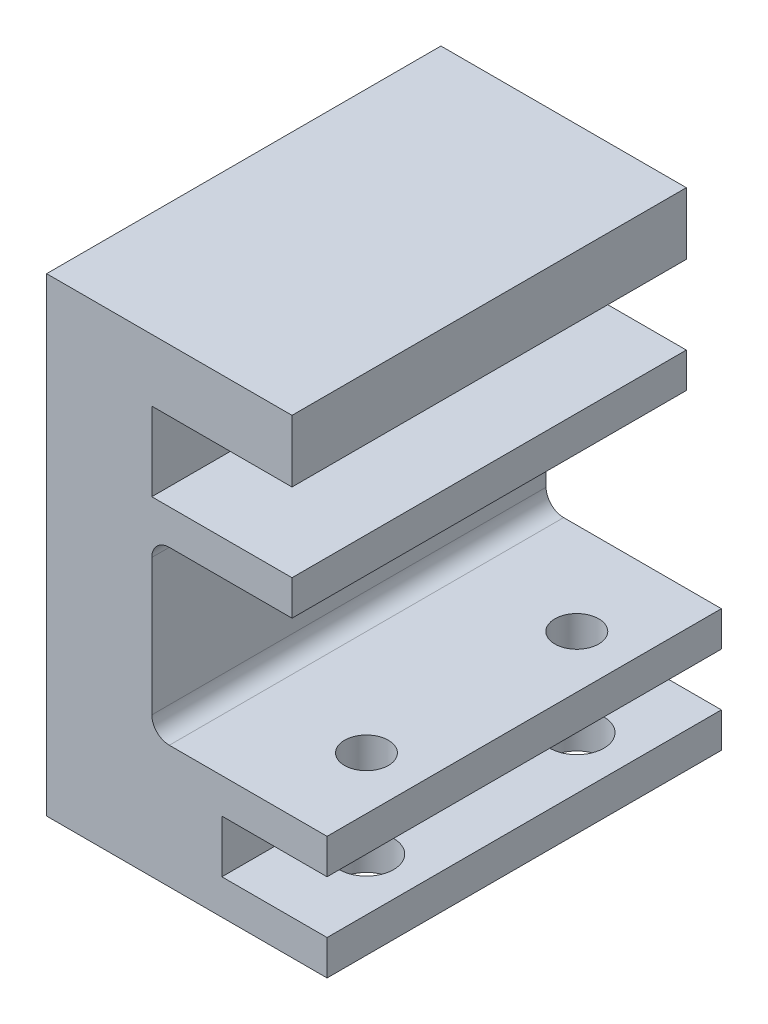
ISO-10303-21;
HEADER;
FILE_DESCRIPTION(('STEP AP214'),'2;1');
FILE_NAME('part.step','',(''),(''),'','','');
FILE_SCHEMA(('AUTOMOTIVE_DESIGN { 1 0 10303 214 1 1 1 1 }'));
ENDSEC;
DATA;
#1=APPLICATION_CONTEXT('core data for automotive mechanical design processes');
#2=APPLICATION_PROTOCOL_DEFINITION('international standard','automotive_design',2000,#1);
#3=PRODUCT_CONTEXT('',#1,'mechanical');
#4=PRODUCT('Part','Part','',(#3));
#5=PRODUCT_RELATED_PRODUCT_CATEGORY('part','',(#4));
#6=PRODUCT_DEFINITION_FORMATION('','',#4);
#7=PRODUCT_DEFINITION_CONTEXT('part definition',#1,'design');
#8=PRODUCT_DEFINITION('design','',#6,#7);
#9=PRODUCT_DEFINITION_SHAPE('','',#8);
#10=(LENGTH_UNIT() NAMED_UNIT(*) SI_UNIT(.MILLI.,.METRE.));
#11=(NAMED_UNIT(*) PLANE_ANGLE_UNIT() SI_UNIT($,.RADIAN.));
#12=(NAMED_UNIT(*) SI_UNIT($,.STERADIAN.) SOLID_ANGLE_UNIT());
#13=UNCERTAINTY_MEASURE_WITH_UNIT(LENGTH_MEASURE(1.E-05),#10,'distance_accuracy_value','');
#14=(GEOMETRIC_REPRESENTATION_CONTEXT(3) GLOBAL_UNCERTAINTY_ASSIGNED_CONTEXT((#13)) GLOBAL_UNIT_ASSIGNED_CONTEXT((#10,
#11,#12)) REPRESENTATION_CONTEXT('',''));
#15=CARTESIAN_POINT('',(0.,0.,0.));
#16=DIRECTION('',(0.,0.,1.));
#17=DIRECTION('',(1.,0.,0.));
#18=AXIS2_PLACEMENT_3D('',#15,#16,#17);
#19=CARTESIAN_POINT('',(-6.34998882399999,-20.32,-35.7134));
#20=DIRECTION('',(0.,-1.,0.));
#21=DIRECTION('',(0.,0.,-1.));
#22=AXIS2_PLACEMENT_3D('',#19,#20,#21);
#23=PLANE('',#22);
#24=CARTESIAN_POINT('',(15.875,-20.32,19.0500000000001));
#25=DIRECTION('',(0.,1.,0.));
#26=DIRECTION('',(0.,0.,1.));
#27=AXIS2_PLACEMENT_3D('',#24,#25,#26);
#28=CIRCLE('',#27,3.96875);
#29=CARTESIAN_POINT('',(15.875,-20.32,23.0187500000001));
#30=VERTEX_POINT('',#29);
#31=EDGE_CURVE('E407',#30,#30,#28,.T.);
#32=ORIENTED_EDGE('',*,*,#31,.F.);
#33=EDGE_LOOP('',(#32));
#34=FACE_BOUND('',#33,.T.);
#35=DIRECTION('',(1.,0.,0.));
#36=VECTOR('',#35,1.);
#37=CARTESIAN_POINT('',(-6.34998882399999,-20.32,-35.7124));
#38=LINE('',#37,#36);
#39=CARTESIAN_POINT('',(-3.17498882399999,-20.32,-35.7124));
#40=VERTEX_POINT('',#39);
#41=CARTESIAN_POINT('',(25.4,-20.32,-35.7124));
#42=VERTEX_POINT('',#41);
#43=EDGE_CURVE('E285',#40,#42,#38,.T.);
#44=ORIENTED_EDGE('',*,*,#43,.F.);
#45=DIRECTION('',(0.,0.,1.));
#46=VECTOR('',#45,1.);
#47=CARTESIAN_POINT('',(-3.17498882399999,-20.32,35.7124));
#48=LINE('',#47,#46);
#49=CARTESIAN_POINT('',(-3.17498882399999,-20.32,35.7124));
#50=VERTEX_POINT('',#49);
#51=EDGE_CURVE('E258',#40,#50,#48,.T.);
#52=ORIENTED_EDGE('',*,*,#51,.T.);
#53=DIRECTION('',(1.,0.,0.));
#54=VECTOR('',#53,1.);
#55=CARTESIAN_POINT('',(-6.34998882399999,-20.32,35.7124));
#56=LINE('',#55,#54);
#57=CARTESIAN_POINT('',(25.4,-20.32,35.7124));
#58=VERTEX_POINT('',#57);
#59=EDGE_CURVE('E208',#50,#58,#56,.T.);
#60=ORIENTED_EDGE('',*,*,#59,.T.);
#61=DIRECTION('',(0.,0.,1.));
#62=VECTOR('',#61,1.);
#63=CARTESIAN_POINT('',(25.4,-20.32,-35.7134));
#64=LINE('',#63,#62);
#65=EDGE_CURVE('E200',#42,#58,#64,.T.);
#66=ORIENTED_EDGE('',*,*,#65,.F.);
#67=EDGE_LOOP('',(#44,#52,#60,#66));
#68=FACE_BOUND('',#67,.T.);
#69=CARTESIAN_POINT('',(15.875,-20.32,-19.0499999999999));
#70=DIRECTION('',(0.,1.,0.));
#71=DIRECTION('',(0.,0.,1.));
#72=AXIS2_PLACEMENT_3D('',#69,#70,#71);
#73=CIRCLE('',#72,3.96875);
#74=CARTESIAN_POINT('',(15.875,-20.32,-15.0812499999999));
#75=VERTEX_POINT('',#74);
#76=EDGE_CURVE('E399',#75,#75,#73,.T.);
#77=ORIENTED_EDGE('',*,*,#76,.F.);
#78=EDGE_LOOP('',(#77));
#79=FACE_BOUND('',#78,.T.);
#80=ADVANCED_FACE('F43',(#34,#68,#79),#23,.F.);
#81=CARTESIAN_POINT('',(-25.4,-42.545,35.7124));
#82=DIRECTION('',(1.,0.,0.));
#83=DIRECTION('',(0.,0.,-1.));
#84=AXIS2_PLACEMENT_3D('',#81,#82,#83);
#85=PLANE('',#84);
#86=DIRECTION('',(0.,-1.,0.));
#87=VECTOR('',#86,1.);
#88=CARTESIAN_POINT('',(-25.4,-42.545,-35.7124));
#89=LINE('',#88,#87);
#90=CARTESIAN_POINT('',(-25.4,42.545,-35.7124));
#91=VERTEX_POINT('',#90);
#92=CARTESIAN_POINT('',(-25.4,-42.545,-35.7124));
#93=VERTEX_POINT('',#92);
#94=EDGE_CURVE('E232',#91,#93,#89,.T.);
#95=ORIENTED_EDGE('',*,*,#94,.T.);
#96=DIRECTION('',(0.,0.,-1.));
#97=VECTOR('',#96,1.);
#98=CARTESIAN_POINT('',(-25.4,-42.545,35.7124));
#99=LINE('',#98,#97);
#100=CARTESIAN_POINT('',(-25.4,-42.545,35.7124));
#101=VERTEX_POINT('',#100);
#102=EDGE_CURVE('E241',#101,#93,#99,.T.);
#103=ORIENTED_EDGE('',*,*,#102,.F.);
#104=DIRECTION('',(0.,-1.,0.));
#105=VECTOR('',#104,1.);
#106=CARTESIAN_POINT('',(-25.4,-42.545,35.7124));
#107=LINE('',#106,#105);
#108=CARTESIAN_POINT('',(-25.4,42.545,35.7124));
#109=VERTEX_POINT('',#108);
#110=EDGE_CURVE('E220',#109,#101,#107,.T.);
#111=ORIENTED_EDGE('',*,*,#110,.F.);
#112=DIRECTION('',(0.,0.,-1.));
#113=VECTOR('',#112,1.);
#114=CARTESIAN_POINT('',(-25.4,42.545,35.7124));
#115=LINE('',#114,#113);
#116=EDGE_CURVE('E245',#109,#91,#115,.T.);
#117=ORIENTED_EDGE('',*,*,#116,.T.);
#118=EDGE_LOOP('',(#95,#103,#111,#117));
#119=FACE_BOUND('',#118,.T.);
#120=CARTESIAN_POINT('',(-25.4,24.13,0.));
#121=DIRECTION('',(-1.,0.,0.));
#122=DIRECTION('',(0.,0.,1.));
#123=AXIS2_PLACEMENT_3D('',#120,#121,#122);
#124=CIRCLE('',#123,2.4892);
#125=CARTESIAN_POINT('',(-25.4,24.13,2.48920000000005));
#126=VERTEX_POINT('',#125);
#127=EDGE_CURVE('E375',#126,#126,#124,.T.);
#128=ORIENTED_EDGE('',*,*,#127,.F.);
#129=EDGE_LOOP('',(#128));
#130=FACE_BOUND('',#129,.T.);
#131=ADVANCED_FACE('F415',(#119,#130),#85,.F.);
#132=CARTESIAN_POINT('',(-25.4,42.545,35.7124));
#133=DIRECTION('',(0.,-1.,0.));
#134=DIRECTION('',(0.,0.,-1.));
#135=AXIS2_PLACEMENT_3D('',#132,#133,#134);
#136=PLANE('',#135);
#137=DIRECTION('',(0.,0.,-1.));
#138=VECTOR('',#137,1.);
#139=CARTESIAN_POINT('',(19.05,42.545,35.712412));
#140=LINE('',#139,#138);
#141=CARTESIAN_POINT('',(19.05,42.545,35.7124));
#142=VERTEX_POINT('',#141);
#143=CARTESIAN_POINT('',(19.05,42.545,-35.7124));
#144=VERTEX_POINT('',#143);
#145=EDGE_CURVE('E179',#142,#144,#140,.T.);
#146=ORIENTED_EDGE('',*,*,#145,.T.);
#147=DIRECTION('',(-1.,0.,0.));
#148=VECTOR('',#147,1.);
#149=CARTESIAN_POINT('',(-25.4,42.545,-35.7124));
#150=LINE('',#149,#148);
#151=EDGE_CURVE('E229',#144,#91,#150,.T.);
#152=ORIENTED_EDGE('',*,*,#151,.T.);
#153=ORIENTED_EDGE('',*,*,#116,.F.);
#154=DIRECTION('',(-1.,0.,0.));
#155=VECTOR('',#154,1.);
#156=CARTESIAN_POINT('',(-25.4,42.545,35.7124));
#157=LINE('',#156,#155);
#158=EDGE_CURVE('E216',#142,#109,#157,.T.);
#159=ORIENTED_EDGE('',*,*,#158,.F.);
#160=EDGE_LOOP('',(#146,#152,#153,#159));
#161=FACE_BOUND('',#160,.T.);
#162=ADVANCED_FACE('F420',(#161),#136,.F.);
#163=CARTESIAN_POINT('',(0.,0.,35.7124));
#164=DIRECTION('',(0.,0.,-1.));
#165=DIRECTION('',(-1.,0.,0.));
#166=AXIS2_PLACEMENT_3D('',#163,#164,#165);
#167=PLANE('',#166);
#168=DIRECTION('',(0.,-1.,0.));
#169=VECTOR('',#168,1.);
#170=CARTESIAN_POINT('',(19.05,0.,35.7124));
#171=LINE('',#170,#169);
#172=CARTESIAN_POINT('',(19.05,31.29915,35.7124));
#173=VERTEX_POINT('',#172);
#174=EDGE_CURVE('E358',#142,#173,#171,.T.);
#175=ORIENTED_EDGE('',*,*,#174,.F.);
#176=ORIENTED_EDGE('',*,*,#158,.T.);
#177=ORIENTED_EDGE('',*,*,#110,.T.);
#178=DIRECTION('',(1.,0.,0.));
#179=VECTOR('',#178,1.);
#180=CARTESIAN_POINT('',(-25.4,-42.545,35.7124));
#181=LINE('',#180,#179);
#182=CARTESIAN_POINT('',(25.4,-42.545,35.7124));
#183=VERTEX_POINT('',#182);
#184=EDGE_CURVE('E223',#101,#183,#181,.T.);
#185=ORIENTED_EDGE('',*,*,#184,.T.);
#186=DIRECTION('',(0.,1.,0.));
#187=VECTOR('',#186,1.);
#188=CARTESIAN_POINT('',(25.4,-42.545,35.7124));
#189=LINE('',#188,#187);
#190=CARTESIAN_POINT('',(25.4,-36.195,35.7124));
#191=VERTEX_POINT('',#190);
#192=EDGE_CURVE('E212',#183,#191,#189,.T.);
#193=ORIENTED_EDGE('',*,*,#192,.T.);
#194=DIRECTION('',(1.,0.,0.));
#195=VECTOR('',#194,1.);
#196=CARTESIAN_POINT('',(6.35000000000001,-36.195,35.7124));
#197=LINE('',#196,#195);
#198=CARTESIAN_POINT('',(6.35000000000001,-36.195,35.7124));
#199=VERTEX_POINT('',#198);
#200=EDGE_CURVE('E331',#199,#191,#197,.T.);
#201=ORIENTED_EDGE('',*,*,#200,.F.);
#202=DIRECTION('',(0.,-1.,0.));
#203=VECTOR('',#202,1.);
#204=CARTESIAN_POINT('',(6.35000000000001,-36.195,35.7124));
#205=LINE('',#204,#203);
#206=CARTESIAN_POINT('',(6.35000000000001,-26.67,35.7124));
#207=VERTEX_POINT('',#206);
#208=EDGE_CURVE('E342',#207,#199,#205,.T.);
#209=ORIENTED_EDGE('',*,*,#208,.F.);
#210=DIRECTION('',(-1.,0.,0.));
#211=VECTOR('',#210,1.);
#212=CARTESIAN_POINT('',(6.35000000000001,-26.67,35.7124));
#213=LINE('',#212,#211);
#214=CARTESIAN_POINT('',(25.4,-26.67,35.7124));
#215=VERTEX_POINT('',#214);
#216=EDGE_CURVE('E346',#215,#207,#213,.T.);
#217=ORIENTED_EDGE('',*,*,#216,.F.);
#218=EDGE_CURVE('E217',#215,#58,#189,.T.);
#219=ORIENTED_EDGE('',*,*,#218,.T.);
#220=ORIENTED_EDGE('',*,*,#59,.F.);
#221=CARTESIAN_POINT('',(-3.17498882399999,-17.145,35.7124));
#222=DIRECTION('',(0.,0.,-1.));
#223=DIRECTION('',(-1.,0.,0.));
#224=AXIS2_PLACEMENT_3D('',#221,#222,#223);
#225=CIRCLE('',#224,3.175);
#226=CARTESIAN_POINT('',(-6.34998882399999,-17.145,35.7124));
#227=VERTEX_POINT('',#226);
#228=EDGE_CURVE('E52',#50,#227,#225,.T.);
#229=ORIENTED_EDGE('',*,*,#228,.T.);
#230=DIRECTION('',(0.,-1.,0.));
#231=VECTOR('',#230,1.);
#232=CARTESIAN_POINT('',(-6.34998882399999,10.72515,35.7124));
#233=LINE('',#232,#231);
#234=CARTESIAN_POINT('',(-6.34998882399999,7.55015000000001,35.7124));
#235=VERTEX_POINT('',#234);
#236=EDGE_CURVE('E273',#235,#227,#233,.T.);
#237=ORIENTED_EDGE('',*,*,#236,.F.);
#238=CARTESIAN_POINT('',(-3.17498882399999,7.55015000000001,35.7124));
#239=DIRECTION('',(0.,0.,-1.));
#240=DIRECTION('',(-1.,0.,0.));
#241=AXIS2_PLACEMENT_3D('',#238,#239,#240);
#242=CIRCLE('',#241,3.175);
#243=CARTESIAN_POINT('',(-3.17498882399999,10.72515,35.7124));
#244=VERTEX_POINT('',#243);
#245=EDGE_CURVE('E261',#235,#244,#242,.T.);
#246=ORIENTED_EDGE('',*,*,#245,.T.);
#247=DIRECTION('',(-1.,0.,0.));
#248=VECTOR('',#247,1.);
#249=CARTESIAN_POINT('',(-6.34998882399999,10.72515,35.7124));
#250=LINE('',#249,#248);
#251=CARTESIAN_POINT('',(19.05,10.72515,35.7124));
#252=VERTEX_POINT('',#251);
#253=EDGE_CURVE('E280',#252,#244,#250,.T.);
#254=ORIENTED_EDGE('',*,*,#253,.F.);
#255=CARTESIAN_POINT('',(19.05,17.07515,35.7124));
#256=VERTEX_POINT('',#255);
#257=EDGE_CURVE('E173',#256,#252,#171,.T.);
#258=ORIENTED_EDGE('',*,*,#257,.F.);
#259=DIRECTION('',(1.,0.,0.));
#260=VECTOR('',#259,1.);
#261=CARTESIAN_POINT('',(-6.34998882399999,17.07515,35.7124));
#262=LINE('',#261,#260);
#263=CARTESIAN_POINT('',(-6.34998882399999,17.07515,35.7124));
#264=VERTEX_POINT('',#263);
#265=EDGE_CURVE('E303',#264,#256,#262,.T.);
#266=ORIENTED_EDGE('',*,*,#265,.F.);
#267=DIRECTION('',(0.,-1.,0.));
#268=VECTOR('',#267,1.);
#269=CARTESIAN_POINT('',(-6.34998882399999,17.07515,35.7124));
#270=LINE('',#269,#268);
#271=CARTESIAN_POINT('',(-6.34998882399999,31.29915,35.7124));
#272=VERTEX_POINT('',#271);
#273=EDGE_CURVE('E308',#272,#264,#270,.T.);
#274=ORIENTED_EDGE('',*,*,#273,.F.);
#275=DIRECTION('',(-1.,0.,0.));
#276=VECTOR('',#275,1.);
#277=CARTESIAN_POINT('',(-6.34998882399999,31.29915,35.7124));
#278=LINE('',#277,#276);
#279=EDGE_CURVE('E312',#173,#272,#278,.T.);
#280=ORIENTED_EDGE('',*,*,#279,.F.);
#281=EDGE_LOOP('',(#175,#176,#177,#185,#193,#201,#209,#217,#219,#220,#229,#237,#246,#254,#258,
#266,#274,#280));
#282=FACE_BOUND('',#281,.T.);
#283=ADVANCED_FACE('F272',(#282),#167,.F.);
#284=CARTESIAN_POINT('',(0.,0.,-35.7124));
#285=DIRECTION('',(0.,0.,-1.));
#286=DIRECTION('',(-1.,0.,0.));
#287=AXIS2_PLACEMENT_3D('',#284,#285,#286);
#288=PLANE('',#287);
#289=ORIENTED_EDGE('',*,*,#151,.F.);
#290=DIRECTION('',(0.,-1.,0.));
#291=VECTOR('',#290,1.);
#292=CARTESIAN_POINT('',(19.05,42.545,-35.7124));
#293=LINE('',#292,#291);
#294=CARTESIAN_POINT('',(19.05,31.29915,-35.7124));
#295=VERTEX_POINT('',#294);
#296=EDGE_CURVE('E180',#144,#295,#293,.T.);
#297=ORIENTED_EDGE('',*,*,#296,.T.);
#298=DIRECTION('',(-1.,0.,0.));
#299=VECTOR('',#298,1.);
#300=CARTESIAN_POINT('',(-6.34998882399999,31.29915,-35.7124));
#301=LINE('',#300,#299);
#302=CARTESIAN_POINT('',(-6.34998882399999,31.29915,-35.7124));
#303=VERTEX_POINT('',#302);
#304=EDGE_CURVE('E307',#295,#303,#301,.T.);
#305=ORIENTED_EDGE('',*,*,#304,.T.);
#306=DIRECTION('',(0.,-1.,0.));
#307=VECTOR('',#306,1.);
#308=CARTESIAN_POINT('',(-6.34998882399999,17.07515,-35.7124));
#309=LINE('',#308,#307);
#310=CARTESIAN_POINT('',(-6.34998882399999,17.07515,-35.7124));
#311=VERTEX_POINT('',#310);
#312=EDGE_CURVE('E318',#303,#311,#309,.T.);
#313=ORIENTED_EDGE('',*,*,#312,.T.);
#314=DIRECTION('',(1.,0.,0.));
#315=VECTOR('',#314,1.);
#316=CARTESIAN_POINT('',(-6.34998882399999,17.07515,-35.7124));
#317=LINE('',#316,#315);
#318=CARTESIAN_POINT('',(19.05,17.07515,-35.7124));
#319=VERTEX_POINT('',#318);
#320=EDGE_CURVE('E190',#311,#319,#317,.T.);
#321=ORIENTED_EDGE('',*,*,#320,.T.);
#322=DIRECTION('',(0.,-1.,0.));
#323=VECTOR('',#322,1.);
#324=CARTESIAN_POINT('',(19.05,42.545,-35.7124));
#325=LINE('',#324,#323);
#326=CARTESIAN_POINT('',(19.05,10.72515,-35.7124));
#327=VERTEX_POINT('',#326);
#328=EDGE_CURVE('E170',#319,#327,#325,.T.);
#329=ORIENTED_EDGE('',*,*,#328,.T.);
#330=DIRECTION('',(-1.,0.,0.));
#331=VECTOR('',#330,1.);
#332=CARTESIAN_POINT('',(-6.34998882399999,10.72515,-35.7124));
#333=LINE('',#332,#331);
#334=CARTESIAN_POINT('',(-3.17498882399999,10.72515,-35.7124));
#335=VERTEX_POINT('',#334);
#336=EDGE_CURVE('E186',#327,#335,#333,.T.);
#337=ORIENTED_EDGE('',*,*,#336,.T.);
#338=CARTESIAN_POINT('',(-3.17498882399999,7.55015000000001,-35.7124));
#339=DIRECTION('',(0.,0.,-1.));
#340=DIRECTION('',(-1.,0.,0.));
#341=AXIS2_PLACEMENT_3D('',#338,#339,#340);
#342=CIRCLE('',#341,3.175);
#343=CARTESIAN_POINT('',(-6.34998882399999,7.55015000000001,-35.7124));
#344=VERTEX_POINT('',#343);
#345=EDGE_CURVE('E264',#335,#344,#342,.F.);
#346=ORIENTED_EDGE('',*,*,#345,.T.);
#347=DIRECTION('',(0.,-1.,0.));
#348=VECTOR('',#347,1.);
#349=CARTESIAN_POINT('',(-6.34998882399999,10.72515,-35.7124));
#350=LINE('',#349,#348);
#351=CARTESIAN_POINT('',(-6.34998882399999,-17.145,-35.7124));
#352=VERTEX_POINT('',#351);
#353=EDGE_CURVE('E288',#344,#352,#350,.T.);
#354=ORIENTED_EDGE('',*,*,#353,.T.);
#355=CARTESIAN_POINT('',(-3.17498882399999,-17.145,-35.7124));
#356=DIRECTION('',(0.,0.,-1.));
#357=DIRECTION('',(-1.,0.,0.));
#358=AXIS2_PLACEMENT_3D('',#355,#356,#357);
#359=CIRCLE('',#358,3.175);
#360=EDGE_CURVE('E11',#352,#40,#359,.F.);
#361=ORIENTED_EDGE('',*,*,#360,.T.);
#362=ORIENTED_EDGE('',*,*,#43,.T.);
#363=DIRECTION('',(0.,1.,0.));
#364=VECTOR('',#363,1.);
#365=CARTESIAN_POINT('',(25.4,-42.545,-35.7124));
#366=LINE('',#365,#364);
#367=CARTESIAN_POINT('',(25.4,-26.67,-35.7124));
#368=VERTEX_POINT('',#367);
#369=EDGE_CURVE('E199',#368,#42,#366,.T.);
#370=ORIENTED_EDGE('',*,*,#369,.F.);
#371=DIRECTION('',(-1.,0.,0.));
#372=VECTOR('',#371,1.);
#373=CARTESIAN_POINT('',(6.35000000000001,-26.67,-35.7124));
#374=LINE('',#373,#372);
#375=CARTESIAN_POINT('',(6.35000000000001,-26.67,-35.7124));
#376=VERTEX_POINT('',#375);
#377=EDGE_CURVE('E315',#368,#376,#374,.T.);
#378=ORIENTED_EDGE('',*,*,#377,.T.);
#379=DIRECTION('',(0.,-1.,0.));
#380=VECTOR('',#379,1.);
#381=CARTESIAN_POINT('',(6.35000000000001,-36.195,-35.7124));
#382=LINE('',#381,#380);
#383=CARTESIAN_POINT('',(6.35000000000001,-36.195,-35.7124));
#384=VERTEX_POINT('',#383);
#385=EDGE_CURVE('E354',#376,#384,#382,.T.);
#386=ORIENTED_EDGE('',*,*,#385,.T.);
#387=DIRECTION('',(1.,0.,0.));
#388=VECTOR('',#387,1.);
#389=CARTESIAN_POINT('',(6.35000000000001,-36.195,-35.7124));
#390=LINE('',#389,#388);
#391=CARTESIAN_POINT('',(25.4,-36.195,-35.7124));
#392=VERTEX_POINT('',#391);
#393=EDGE_CURVE('E350',#384,#392,#390,.T.);
#394=ORIENTED_EDGE('',*,*,#393,.T.);
#395=CARTESIAN_POINT('',(25.4,-42.545,-35.7124));
#396=VERTEX_POINT('',#395);
#397=EDGE_CURVE('E205',#396,#392,#366,.T.);
#398=ORIENTED_EDGE('',*,*,#397,.F.);
#399=DIRECTION('',(1.,0.,0.));
#400=VECTOR('',#399,1.);
#401=CARTESIAN_POINT('',(-25.4,-42.545,-35.7124));
#402=LINE('',#401,#400);
#403=EDGE_CURVE('E235',#93,#396,#402,.T.);
#404=ORIENTED_EDGE('',*,*,#403,.F.);
#405=ORIENTED_EDGE('',*,*,#94,.F.);
#406=EDGE_LOOP('',(#289,#297,#305,#313,#321,#329,#337,#346,#354,#361,#362,#370,#378,#386,#394,
#398,#404,#405));
#407=FACE_BOUND('',#406,.T.);
#408=ADVANCED_FACE('F185',(#407),#288,.T.);
#409=CARTESIAN_POINT('',(-6.34998882399999,10.72515,-35.7134));
#410=DIRECTION('',(0.,1.,0.));
#411=DIRECTION('',(-1.,0.,0.));
#412=AXIS2_PLACEMENT_3D('',#409,#410,#411);
#413=PLANE('',#412);
#414=ORIENTED_EDGE('',*,*,#253,.T.);
#415=DIRECTION('',(0.,0.,1.));
#416=VECTOR('',#415,1.);
#417=CARTESIAN_POINT('',(-3.17498882399999,10.72515,-35.7124));
#418=LINE('',#417,#416);
#419=EDGE_CURVE('E197',#244,#335,#418,.F.);
#420=ORIENTED_EDGE('',*,*,#419,.T.);
#421=ORIENTED_EDGE('',*,*,#336,.F.);
#422=DIRECTION('',(0.,0.,-1.));
#423=VECTOR('',#422,1.);
#424=CARTESIAN_POINT('',(19.05,10.72515,35.712412));
#425=LINE('',#424,#423);
#426=EDGE_CURVE('E167',#252,#327,#425,.T.);
#427=ORIENTED_EDGE('',*,*,#426,.F.);
#428=EDGE_LOOP('',(#414,#420,#421,#427));
#429=FACE_BOUND('',#428,.T.);
#430=ADVANCED_FACE('F195',(#429),#413,.F.);
#431=CARTESIAN_POINT('',(-6.34998882399999,17.07515,-35.7124));
#432=DIRECTION('',(0.,-1.,0.));
#433=DIRECTION('',(0.,0.,-1.));
#434=AXIS2_PLACEMENT_3D('',#431,#432,#433);
#435=PLANE('',#434);
#436=DIRECTION('',(0.,0.,1.));
#437=VECTOR('',#436,1.);
#438=CARTESIAN_POINT('',(19.05,17.07515,-35.7134));
#439=LINE('',#438,#437);
#440=EDGE_CURVE('E193',#319,#256,#439,.T.);
#441=ORIENTED_EDGE('',*,*,#440,.F.);
#442=ORIENTED_EDGE('',*,*,#320,.F.);
#443=DIRECTION('',(0.,0.,1.));
#444=VECTOR('',#443,1.);
#445=CARTESIAN_POINT('',(-6.34998882399999,17.07515,-35.7124));
#446=LINE('',#445,#444);
#447=EDGE_CURVE('E293',#311,#264,#446,.T.);
#448=ORIENTED_EDGE('',*,*,#447,.T.);
#449=ORIENTED_EDGE('',*,*,#265,.T.);
#450=EDGE_LOOP('',(#441,#442,#448,#449));
#451=FACE_BOUND('',#450,.T.);
#452=ADVANCED_FACE('F433',(#451),#435,.F.);
#453=CARTESIAN_POINT('',(-6.34998882399999,31.29915,-35.7124));
#454=DIRECTION('',(0.,1.,0.));
#455=DIRECTION('',(0.,0.,1.));
#456=AXIS2_PLACEMENT_3D('',#453,#454,#455);
#457=PLANE('',#456);
#458=DIRECTION('',(0.,0.,-1.));
#459=VECTOR('',#458,1.);
#460=CARTESIAN_POINT('',(19.05,31.29915,-35.7134));
#461=LINE('',#460,#459);
#462=EDGE_CURVE('E192',#173,#295,#461,.T.);
#463=ORIENTED_EDGE('',*,*,#462,.F.);
#464=ORIENTED_EDGE('',*,*,#279,.T.);
#465=DIRECTION('',(0.,0.,1.));
#466=VECTOR('',#465,1.);
#467=CARTESIAN_POINT('',(-6.34998882399999,31.29915,-35.7124));
#468=LINE('',#467,#466);
#469=EDGE_CURVE('E297',#303,#272,#468,.T.);
#470=ORIENTED_EDGE('',*,*,#469,.F.);
#471=ORIENTED_EDGE('',*,*,#304,.F.);
#472=EDGE_LOOP('',(#463,#464,#470,#471));
#473=FACE_BOUND('',#472,.T.);
#474=ADVANCED_FACE('F425',(#473),#457,.F.);
#475=CARTESIAN_POINT('',(25.4,-42.545,35.7124));
#476=DIRECTION('',(-1.,0.,0.));
#477=DIRECTION('',(0.,0.,1.));
#478=AXIS2_PLACEMENT_3D('',#475,#476,#477);
#479=PLANE('',#478);
#480=ORIENTED_EDGE('',*,*,#397,.T.);
#481=DIRECTION('',(0.,0.,1.));
#482=VECTOR('',#481,1.);
#483=CARTESIAN_POINT('',(25.4,-36.195,-35.7134));
#484=LINE('',#483,#482);
#485=EDGE_CURVE('E326',#392,#191,#484,.T.);
#486=ORIENTED_EDGE('',*,*,#485,.T.);
#487=ORIENTED_EDGE('',*,*,#192,.F.);
#488=DIRECTION('',(0.,0.,-1.));
#489=VECTOR('',#488,1.);
#490=CARTESIAN_POINT('',(25.4,-42.545,35.7124));
#491=LINE('',#490,#489);
#492=EDGE_CURVE('E225',#183,#396,#491,.T.);
#493=ORIENTED_EDGE('',*,*,#492,.T.);
#494=EDGE_LOOP('',(#480,#486,#487,#493));
#495=FACE_BOUND('',#494,.T.);
#496=ADVANCED_FACE('F445',(#495),#479,.F.);
#497=ORIENTED_EDGE('',*,*,#218,.F.);
#498=DIRECTION('',(0.,0.,1.));
#499=VECTOR('',#498,1.);
#500=CARTESIAN_POINT('',(25.4,-26.67,-35.7134));
#501=LINE('',#500,#499);
#502=EDGE_CURVE('E327',#368,#215,#501,.T.);
#503=ORIENTED_EDGE('',*,*,#502,.F.);
#504=ORIENTED_EDGE('',*,*,#369,.T.);
#505=ORIENTED_EDGE('',*,*,#65,.T.);
#506=EDGE_LOOP('',(#497,#503,#504,#505));
#507=FACE_BOUND('',#506,.T.);
#508=ADVANCED_FACE('F439',(#507),#479,.F.);
#509=CARTESIAN_POINT('',(-25.4,-42.545,35.7124));
#510=DIRECTION('',(0.,1.,0.));
#511=DIRECTION('',(0.,0.,1.));
#512=AXIS2_PLACEMENT_3D('',#509,#510,#511);
#513=PLANE('',#512);
#514=CARTESIAN_POINT('',(15.875,-42.545,19.0500000000001));
#515=DIRECTION('',(0.,-1.,0.));
#516=DIRECTION('',(0.,0.,-1.));
#517=AXIS2_PLACEMENT_3D('',#514,#515,#516);
#518=CIRCLE('',#517,4.9022);
#519=CARTESIAN_POINT('',(15.875,-42.545,14.1478000000001));
#520=VERTEX_POINT('',#519);
#521=EDGE_CURVE('E391',#520,#520,#518,.T.);
#522=ORIENTED_EDGE('',*,*,#521,.F.);
#523=EDGE_LOOP('',(#522));
#524=FACE_BOUND('',#523,.T.);
#525=CARTESIAN_POINT('',(15.875,-42.545,-19.0499999999999));
#526=DIRECTION('',(0.,-1.,0.));
#527=DIRECTION('',(0.,0.,-1.));
#528=AXIS2_PLACEMENT_3D('',#525,#526,#527);
#529=CIRCLE('',#528,4.9022);
#530=CARTESIAN_POINT('',(15.875,-42.545,-23.9521999999999));
#531=VERTEX_POINT('',#530);
#532=EDGE_CURVE('E383',#531,#531,#529,.T.);
#533=ORIENTED_EDGE('',*,*,#532,.F.);
#534=EDGE_LOOP('',(#533));
#535=FACE_BOUND('',#534,.T.);
#536=ORIENTED_EDGE('',*,*,#403,.T.);
#537=ORIENTED_EDGE('',*,*,#492,.F.);
#538=ORIENTED_EDGE('',*,*,#184,.F.);
#539=ORIENTED_EDGE('',*,*,#102,.T.);
#540=EDGE_LOOP('',(#536,#537,#538,#539));
#541=FACE_BOUND('',#540,.T.);
#542=ADVANCED_FACE('F430',(#524,#535,#541),#513,.F.);
#543=CARTESIAN_POINT('',(-6.34998882399999,10.72515,-35.7134));
#544=DIRECTION('',(-1.,0.,0.));
#545=DIRECTION('',(0.,-1.,0.));
#546=AXIS2_PLACEMENT_3D('',#543,#544,#545);
#547=PLANE('',#546);
#548=ORIENTED_EDGE('',*,*,#353,.F.);
#549=DIRECTION('',(0.,0.,1.));
#550=VECTOR('',#549,1.);
#551=CARTESIAN_POINT('',(-6.34998882399999,7.55015000000001,35.7124));
#552=LINE('',#551,#550);
#553=EDGE_CURVE('E252',#344,#235,#552,.T.);
#554=ORIENTED_EDGE('',*,*,#553,.T.);
#555=ORIENTED_EDGE('',*,*,#236,.T.);
#556=DIRECTION('',(0.,0.,1.));
#557=VECTOR('',#556,1.);
#558=CARTESIAN_POINT('',(-6.34998882399999,-17.145,-35.7124));
#559=LINE('',#558,#557);
#560=EDGE_CURVE('E249',#227,#352,#559,.F.);
#561=ORIENTED_EDGE('',*,*,#560,.T.);
#562=EDGE_LOOP('',(#548,#554,#555,#561));
#563=FACE_BOUND('',#562,.T.);
#564=ADVANCED_FACE('F277',(#563),#547,.F.);
#565=CARTESIAN_POINT('',(-6.34998882399999,17.07515,-35.7124));
#566=DIRECTION('',(-1.,0.,0.));
#567=DIRECTION('',(0.,0.,1.));
#568=AXIS2_PLACEMENT_3D('',#565,#566,#567);
#569=PLANE('',#568);
#570=CARTESIAN_POINT('',(-6.34998882399999,24.13,0.));
#571=DIRECTION('',(-1.,0.,0.));
#572=DIRECTION('',(0.,0.,1.));
#573=AXIS2_PLACEMENT_3D('',#570,#571,#572);
#574=CIRCLE('',#573,2.4892);
#575=CARTESIAN_POINT('',(-6.34998882399999,24.13,2.48920000000005));
#576=VERTEX_POINT('',#575);
#577=EDGE_CURVE('E371',#576,#576,#574,.T.);
#578=ORIENTED_EDGE('',*,*,#577,.T.);
#579=EDGE_LOOP('',(#578));
#580=FACE_BOUND('',#579,.T.);
#581=ORIENTED_EDGE('',*,*,#273,.T.);
#582=ORIENTED_EDGE('',*,*,#447,.F.);
#583=ORIENTED_EDGE('',*,*,#312,.F.);
#584=ORIENTED_EDGE('',*,*,#469,.T.);
#585=EDGE_LOOP('',(#581,#582,#583,#584));
#586=FACE_BOUND('',#585,.T.);
#587=ADVANCED_FACE('F429',(#580,#586),#569,.F.);
#588=CARTESIAN_POINT('',(6.35000000000001,-36.195,-35.7134));
#589=DIRECTION('',(0.,-1.,0.));
#590=DIRECTION('',(0.,0.,-1.));
#591=AXIS2_PLACEMENT_3D('',#588,#589,#590);
#592=PLANE('',#591);
#593=CARTESIAN_POINT('',(15.875,-36.195,19.0500000000001));
#594=DIRECTION('',(0.,-1.,0.));
#595=DIRECTION('',(0.,0.,-1.));
#596=AXIS2_PLACEMENT_3D('',#593,#594,#595);
#597=CIRCLE('',#596,4.9022);
#598=CARTESIAN_POINT('',(15.875,-36.195,14.1478000000001));
#599=VERTEX_POINT('',#598);
#600=EDGE_CURVE('E387',#599,#599,#597,.T.);
#601=ORIENTED_EDGE('',*,*,#600,.T.);
#602=EDGE_LOOP('',(#601));
#603=FACE_BOUND('',#602,.T.);
#604=CARTESIAN_POINT('',(15.875,-36.195,-19.0499999999999));
#605=DIRECTION('',(0.,-1.,0.));
#606=DIRECTION('',(0.,0.,-1.));
#607=AXIS2_PLACEMENT_3D('',#604,#605,#606);
#608=CIRCLE('',#607,4.9022);
#609=CARTESIAN_POINT('',(15.875,-36.195,-23.9521999999999));
#610=VERTEX_POINT('',#609);
#611=EDGE_CURVE('E379',#610,#610,#608,.T.);
#612=ORIENTED_EDGE('',*,*,#611,.T.);
#613=EDGE_LOOP('',(#612));
#614=FACE_BOUND('',#613,.T.);
#615=DIRECTION('',(0.,0.,1.));
#616=VECTOR('',#615,1.);
#617=CARTESIAN_POINT('',(6.35000000000001,-36.195,-35.7134));
#618=LINE('',#617,#616);
#619=EDGE_CURVE('E334',#384,#199,#618,.T.);
#620=ORIENTED_EDGE('',*,*,#619,.T.);
#621=ORIENTED_EDGE('',*,*,#200,.T.);
#622=ORIENTED_EDGE('',*,*,#485,.F.);
#623=ORIENTED_EDGE('',*,*,#393,.F.);
#624=EDGE_LOOP('',(#620,#621,#622,#623));
#625=FACE_BOUND('',#624,.T.);
#626=ADVANCED_FACE('F484',(#603,#614,#625),#592,.F.);
#627=CARTESIAN_POINT('',(6.35000000000001,-36.195,-35.7134));
#628=DIRECTION('',(-1.,0.,0.));
#629=DIRECTION('',(0.,0.,1.));
#630=AXIS2_PLACEMENT_3D('',#627,#628,#629);
#631=PLANE('',#630);
#632=DIRECTION('',(0.,0.,1.));
#633=VECTOR('',#632,1.);
#634=CARTESIAN_POINT('',(6.35000000000001,-26.67,-35.7134));
#635=LINE('',#634,#633);
#636=EDGE_CURVE('E330',#376,#207,#635,.T.);
#637=ORIENTED_EDGE('',*,*,#636,.T.);
#638=ORIENTED_EDGE('',*,*,#208,.T.);
#639=ORIENTED_EDGE('',*,*,#619,.F.);
#640=ORIENTED_EDGE('',*,*,#385,.F.);
#641=EDGE_LOOP('',(#637,#638,#639,#640));
#642=FACE_BOUND('',#641,.T.);
#643=ADVANCED_FACE('F488',(#642),#631,.F.);
#644=CARTESIAN_POINT('',(6.35000000000001,-26.67,-35.7134));
#645=DIRECTION('',(0.,1.,0.));
#646=DIRECTION('',(0.,0.,1.));
#647=AXIS2_PLACEMENT_3D('',#644,#645,#646);
#648=PLANE('',#647);
#649=CARTESIAN_POINT('',(15.875,-26.67,19.0500000000001));
#650=DIRECTION('',(0.,1.,0.));
#651=DIRECTION('',(0.,0.,1.));
#652=AXIS2_PLACEMENT_3D('',#649,#650,#651);
#653=CIRCLE('',#652,3.96875);
#654=CARTESIAN_POINT('',(15.875,-26.67,23.0187500000001));
#655=VERTEX_POINT('',#654);
#656=EDGE_CURVE('E403',#655,#655,#653,.T.);
#657=ORIENTED_EDGE('',*,*,#656,.T.);
#658=EDGE_LOOP('',(#657));
#659=FACE_BOUND('',#658,.T.);
#660=CARTESIAN_POINT('',(15.875,-26.67,-19.0499999999999));
#661=DIRECTION('',(0.,1.,0.));
#662=DIRECTION('',(0.,0.,1.));
#663=AXIS2_PLACEMENT_3D('',#660,#661,#662);
#664=CIRCLE('',#663,3.96875);
#665=CARTESIAN_POINT('',(15.875,-26.67,-15.0812499999999));
#666=VERTEX_POINT('',#665);
#667=EDGE_CURVE('E395',#666,#666,#664,.T.);
#668=ORIENTED_EDGE('',*,*,#667,.T.);
#669=EDGE_LOOP('',(#668));
#670=FACE_BOUND('',#669,.T.);
#671=ORIENTED_EDGE('',*,*,#502,.T.);
#672=ORIENTED_EDGE('',*,*,#216,.T.);
#673=ORIENTED_EDGE('',*,*,#636,.F.);
#674=ORIENTED_EDGE('',*,*,#377,.F.);
#675=EDGE_LOOP('',(#671,#672,#673,#674));
#676=FACE_BOUND('',#675,.T.);
#677=ADVANCED_FACE('F496',(#659,#670,#676),#648,.F.);
#678=CARTESIAN_POINT('',(19.05,42.545,35.712412));
#679=DIRECTION('',(1.,0.,0.));
#680=DIRECTION('',(0.,1.,0.));
#681=AXIS2_PLACEMENT_3D('',#678,#679,#680);
#682=PLANE('',#681);
#683=ORIENTED_EDGE('',*,*,#174,.T.);
#684=ORIENTED_EDGE('',*,*,#462,.T.);
#685=ORIENTED_EDGE('',*,*,#296,.F.);
#686=ORIENTED_EDGE('',*,*,#145,.F.);
#687=EDGE_LOOP('',(#683,#684,#685,#686));
#688=FACE_BOUND('',#687,.T.);
#689=ADVANCED_FACE('F470',(#688),#682,.T.);
#690=ORIENTED_EDGE('',*,*,#257,.T.);
#691=ORIENTED_EDGE('',*,*,#426,.T.);
#692=ORIENTED_EDGE('',*,*,#328,.F.);
#693=ORIENTED_EDGE('',*,*,#440,.T.);
#694=EDGE_LOOP('',(#690,#691,#692,#693));
#695=FACE_BOUND('',#694,.T.);
#696=ADVANCED_FACE('F169',(#695),#682,.T.);
#697=CARTESIAN_POINT('',(-25.4,24.13,0.));
#698=DIRECTION('',(-1.,0.,0.));
#699=DIRECTION('',(0.,0.,1.));
#700=AXIS2_PLACEMENT_3D('',#697,#698,#699);
#701=CYLINDRICAL_SURFACE('',#700,2.4892);
#702=ORIENTED_EDGE('',*,*,#577,.F.);
#703=EDGE_LOOP('',(#702));
#704=FACE_BOUND('',#703,.T.);
#705=ORIENTED_EDGE('',*,*,#127,.T.);
#706=EDGE_LOOP('',(#705));
#707=FACE_BOUND('',#706,.T.);
#708=ADVANCED_FACE('F518',(#704,#707),#701,.F.);
#709=CARTESIAN_POINT('',(15.875,-42.545,-19.0499999999999));
#710=DIRECTION('',(0.,-1.,0.));
#711=DIRECTION('',(0.,0.,-1.));
#712=AXIS2_PLACEMENT_3D('',#709,#710,#711);
#713=CYLINDRICAL_SURFACE('',#712,4.9022);
#714=ORIENTED_EDGE('',*,*,#611,.F.);
#715=EDGE_LOOP('',(#714));
#716=FACE_BOUND('',#715,.T.);
#717=ORIENTED_EDGE('',*,*,#532,.T.);
#718=EDGE_LOOP('',(#717));
#719=FACE_BOUND('',#718,.T.);
#720=ADVANCED_FACE('F521',(#716,#719),#713,.F.);
#721=CARTESIAN_POINT('',(15.875,-42.545,19.0500000000001));
#722=DIRECTION('',(0.,-1.,0.));
#723=DIRECTION('',(0.,0.,-1.));
#724=AXIS2_PLACEMENT_3D('',#721,#722,#723);
#725=CYLINDRICAL_SURFACE('',#724,4.9022);
#726=ORIENTED_EDGE('',*,*,#600,.F.);
#727=EDGE_LOOP('',(#726));
#728=FACE_BOUND('',#727,.T.);
#729=ORIENTED_EDGE('',*,*,#521,.T.);
#730=EDGE_LOOP('',(#729));
#731=FACE_BOUND('',#730,.T.);
#732=ADVANCED_FACE('F528',(#728,#731),#725,.F.);
#733=CARTESIAN_POINT('',(15.875,-20.32,-19.0499999999999));
#734=DIRECTION('',(0.,1.,0.));
#735=DIRECTION('',(0.,0.,1.));
#736=AXIS2_PLACEMENT_3D('',#733,#734,#735);
#737=CYLINDRICAL_SURFACE('',#736,3.96875);
#738=ORIENTED_EDGE('',*,*,#667,.F.);
#739=EDGE_LOOP('',(#738));
#740=FACE_BOUND('',#739,.T.);
#741=ORIENTED_EDGE('',*,*,#76,.T.);
#742=EDGE_LOOP('',(#741));
#743=FACE_BOUND('',#742,.T.);
#744=ADVANCED_FACE('F455',(#740,#743),#737,.F.);
#745=CARTESIAN_POINT('',(15.875,-20.32,19.0500000000001));
#746=DIRECTION('',(0.,1.,0.));
#747=DIRECTION('',(0.,0.,1.));
#748=AXIS2_PLACEMENT_3D('',#745,#746,#747);
#749=CYLINDRICAL_SURFACE('',#748,3.96875);
#750=ORIENTED_EDGE('',*,*,#656,.F.);
#751=EDGE_LOOP('',(#750));
#752=FACE_BOUND('',#751,.T.);
#753=ORIENTED_EDGE('',*,*,#31,.T.);
#754=EDGE_LOOP('',(#753));
#755=FACE_BOUND('',#754,.T.);
#756=ADVANCED_FACE('F412',(#752,#755),#749,.F.);
#757=CARTESIAN_POINT('',(-3.17498882399999,7.55015000000001,-35.7134));
#758=DIRECTION('',(0.,0.,-1.));
#759=DIRECTION('',(-1.,0.,0.));
#760=AXIS2_PLACEMENT_3D('',#757,#758,#759);
#761=CYLINDRICAL_SURFACE('',#760,3.175);
#762=ORIENTED_EDGE('',*,*,#345,.F.);
#763=ORIENTED_EDGE('',*,*,#419,.F.);
#764=ORIENTED_EDGE('',*,*,#245,.F.);
#765=ORIENTED_EDGE('',*,*,#553,.F.);
#766=EDGE_LOOP('',(#762,#763,#764,#765));
#767=FACE_BOUND('',#766,.T.);
#768=ADVANCED_FACE('F448',(#767),#761,.F.);
#769=CARTESIAN_POINT('',(-3.17498882399999,-17.145,-35.7134));
#770=DIRECTION('',(0.,0.,-1.));
#771=DIRECTION('',(-1.,0.,0.));
#772=AXIS2_PLACEMENT_3D('',#769,#770,#771);
#773=CYLINDRICAL_SURFACE('',#772,3.175);
#774=ORIENTED_EDGE('',*,*,#360,.F.);
#775=ORIENTED_EDGE('',*,*,#560,.F.);
#776=ORIENTED_EDGE('',*,*,#228,.F.);
#777=ORIENTED_EDGE('',*,*,#51,.F.);
#778=EDGE_LOOP('',(#774,#775,#776,#777));
#779=FACE_BOUND('',#778,.T.);
#780=ADVANCED_FACE('F45',(#779),#773,.F.);
#781=CLOSED_SHELL('',(#80,#131,#162,#283,#408,#430,#452,#474,#496,#508,#542,#564,#587,#626,#643,
#677,#689,#696,#708,#720,#732,#744,#756,#768,#780));
#782=MANIFOLD_SOLID_BREP('B2',#781);
#783=ADVANCED_BREP_SHAPE_REPRESENTATION('',(#18,#782),#14);
#784=SHAPE_DEFINITION_REPRESENTATION(#9,#783);
ENDSEC;
END-ISO-10303-21;
